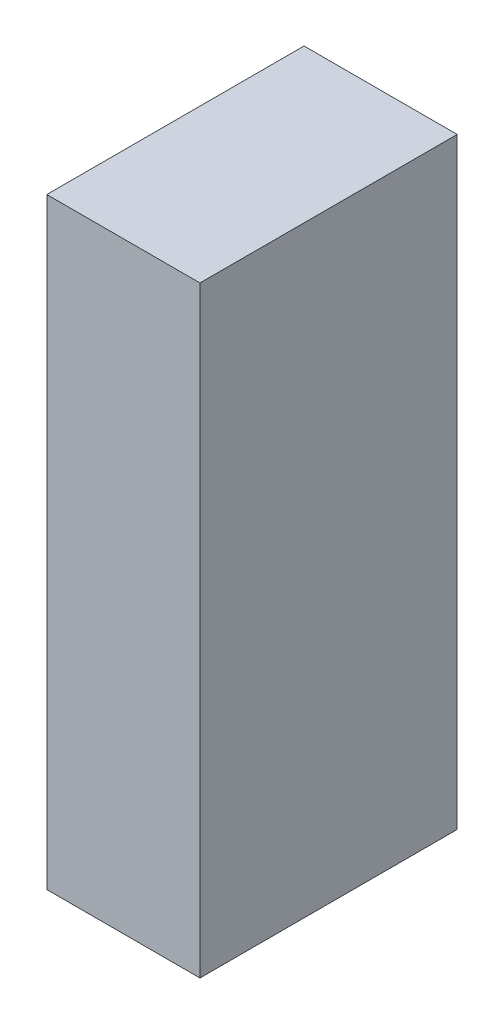
ISO-10303-21;
HEADER;
FILE_DESCRIPTION(('STEP AP214'),'2;1');
FILE_NAME('part.step','',(''),(''),'','','');
FILE_SCHEMA(('AUTOMOTIVE_DESIGN { 1 0 10303 214 1 1 1 1 }'));
ENDSEC;
DATA;
#1=APPLICATION_CONTEXT('core data for automotive mechanical design processes');
#2=APPLICATION_PROTOCOL_DEFINITION('international standard','automotive_design',2000,#1);
#3=PRODUCT_CONTEXT('',#1,'mechanical');
#4=PRODUCT('Part','Part','',(#3));
#5=PRODUCT_RELATED_PRODUCT_CATEGORY('part','',(#4));
#6=PRODUCT_DEFINITION_FORMATION('','',#4);
#7=PRODUCT_DEFINITION_CONTEXT('part definition',#1,'design');
#8=PRODUCT_DEFINITION('design','',#6,#7);
#9=PRODUCT_DEFINITION_SHAPE('','',#8);
#10=(LENGTH_UNIT() NAMED_UNIT(*) SI_UNIT(.MILLI.,.METRE.));
#11=(NAMED_UNIT(*) PLANE_ANGLE_UNIT() SI_UNIT($,.RADIAN.));
#12=(NAMED_UNIT(*) SI_UNIT($,.STERADIAN.) SOLID_ANGLE_UNIT());
#13=UNCERTAINTY_MEASURE_WITH_UNIT(LENGTH_MEASURE(1.E-05),#10,'distance_accuracy_value','');
#14=(GEOMETRIC_REPRESENTATION_CONTEXT(3) GLOBAL_UNCERTAINTY_ASSIGNED_CONTEXT((#13)) GLOBAL_UNIT_ASSIGNED_CONTEXT((#10,
#11,#12)) REPRESENTATION_CONTEXT('',''));
#15=CARTESIAN_POINT('',(0.,0.,0.));
#16=DIRECTION('',(0.,0.,1.));
#17=DIRECTION('',(1.,0.,0.));
#18=AXIS2_PLACEMENT_3D('',#15,#16,#17);
#19=CARTESIAN_POINT('',(-1.714,-1.397,0.));
#20=DIRECTION('',(0.,-1.,0.));
#21=DIRECTION('',(0.,0.,1.));
#22=AXIS2_PLACEMENT_3D('',#19,#20,#21);
#23=PLANE('',#22);
#24=DIRECTION('',(-1.,0.,0.));
#25=VECTOR('',#24,1.);
#26=CARTESIAN_POINT('',(-1.003,-1.397,0.));
#27=LINE('',#26,#25);
#28=CARTESIAN_POINT('',(-1.003,-1.397,0.));
#29=VERTEX_POINT('',#28);
#30=CARTESIAN_POINT('',(-1.714,-1.397,0.));
#31=VERTEX_POINT('',#30);
#32=EDGE_CURVE('E11',#29,#31,#27,.T.);
#33=ORIENTED_EDGE('',*,*,#32,.F.);
#34=DIRECTION('',(0.,0.,-1.));
#35=VECTOR('',#34,1.);
#36=CARTESIAN_POINT('',(-1.003,-1.397,1.194));
#37=LINE('',#36,#35);
#38=CARTESIAN_POINT('',(-1.003,-1.397,1.194));
#39=VERTEX_POINT('',#38);
#40=EDGE_CURVE('E24',#39,#29,#37,.T.);
#41=ORIENTED_EDGE('',*,*,#40,.F.);
#42=DIRECTION('',(1.,0.,0.));
#43=VECTOR('',#42,1.);
#44=CARTESIAN_POINT('',(-1.714,-1.397,1.194));
#45=LINE('',#44,#43);
#46=CARTESIAN_POINT('',(-1.714,-1.397,1.194));
#47=VERTEX_POINT('',#46);
#48=EDGE_CURVE('E88',#47,#39,#45,.T.);
#49=ORIENTED_EDGE('',*,*,#48,.F.);
#50=DIRECTION('',(0.,0.,1.));
#51=VECTOR('',#50,1.);
#52=CARTESIAN_POINT('',(-1.714,-1.397,0.));
#53=LINE('',#52,#51);
#54=EDGE_CURVE('E77',#31,#47,#53,.T.);
#55=ORIENTED_EDGE('',*,*,#54,.F.);
#56=EDGE_LOOP('',(#33,#41,#49,#55));
#57=FACE_BOUND('',#56,.T.);
#58=ADVANCED_FACE('F17',(#57),#23,.T.);
#59=CARTESIAN_POINT('',(-1.003,-1.397,0.));
#60=DIRECTION('',(1.,0.,0.));
#61=DIRECTION('',(0.,0.,1.));
#62=AXIS2_PLACEMENT_3D('',#59,#60,#61);
#63=PLANE('',#62);
#64=DIRECTION('',(0.,-1.,0.));
#65=VECTOR('',#64,1.);
#66=CARTESIAN_POINT('',(-1.003,1.397,0.));
#67=LINE('',#66,#65);
#68=CARTESIAN_POINT('',(-1.003,1.397,0.));
#69=VERTEX_POINT('',#68);
#70=EDGE_CURVE('E85',#69,#29,#67,.T.);
#71=ORIENTED_EDGE('',*,*,#70,.F.);
#72=DIRECTION('',(0.,0.,-1.));
#73=VECTOR('',#72,1.);
#74=CARTESIAN_POINT('',(-1.003,1.397,1.194));
#75=LINE('',#74,#73);
#76=CARTESIAN_POINT('',(-1.003,1.397,1.194));
#77=VERTEX_POINT('',#76);
#78=EDGE_CURVE('E83',#77,#69,#75,.T.);
#79=ORIENTED_EDGE('',*,*,#78,.F.);
#80=DIRECTION('',(0.,1.,0.));
#81=VECTOR('',#80,1.);
#82=CARTESIAN_POINT('',(-1.003,-1.397,1.194));
#83=LINE('',#82,#81);
#84=EDGE_CURVE('E72',#39,#77,#83,.T.);
#85=ORIENTED_EDGE('',*,*,#84,.F.);
#86=ORIENTED_EDGE('',*,*,#40,.T.);
#87=EDGE_LOOP('',(#71,#79,#85,#86));
#88=FACE_BOUND('',#87,.T.);
#89=ADVANCED_FACE('F90',(#88),#63,.T.);
#90=CARTESIAN_POINT('',(-1.003,1.397,0.));
#91=DIRECTION('',(0.,1.,0.));
#92=DIRECTION('',(0.,0.,1.));
#93=AXIS2_PLACEMENT_3D('',#90,#91,#92);
#94=PLANE('',#93);
#95=DIRECTION('',(1.,0.,0.));
#96=VECTOR('',#95,1.);
#97=CARTESIAN_POINT('',(-1.714,1.397,0.));
#98=LINE('',#97,#96);
#99=CARTESIAN_POINT('',(-1.714,1.397,0.));
#100=VERTEX_POINT('',#99);
#101=EDGE_CURVE('E60',#100,#69,#98,.T.);
#102=ORIENTED_EDGE('',*,*,#101,.F.);
#103=DIRECTION('',(0.,0.,-1.));
#104=VECTOR('',#103,1.);
#105=CARTESIAN_POINT('',(-1.714,1.397,1.194));
#106=LINE('',#105,#104);
#107=CARTESIAN_POINT('',(-1.714,1.397,1.194));
#108=VERTEX_POINT('',#107);
#109=EDGE_CURVE('E54',#108,#100,#106,.T.);
#110=ORIENTED_EDGE('',*,*,#109,.F.);
#111=DIRECTION('',(-1.,0.,0.));
#112=VECTOR('',#111,1.);
#113=CARTESIAN_POINT('',(-1.003,1.397,1.194));
#114=LINE('',#113,#112);
#115=EDGE_CURVE('E58',#77,#108,#114,.T.);
#116=ORIENTED_EDGE('',*,*,#115,.F.);
#117=ORIENTED_EDGE('',*,*,#78,.T.);
#118=EDGE_LOOP('',(#102,#110,#116,#117));
#119=FACE_BOUND('',#118,.T.);
#120=ADVANCED_FACE('F56',(#119),#94,.T.);
#121=CARTESIAN_POINT('',(-1.714,1.397,0.));
#122=DIRECTION('',(-1.,0.,0.));
#123=DIRECTION('',(0.,0.,1.));
#124=AXIS2_PLACEMENT_3D('',#121,#122,#123);
#125=PLANE('',#124);
#126=DIRECTION('',(0.,1.,0.));
#127=VECTOR('',#126,1.);
#128=CARTESIAN_POINT('',(-1.714,-1.397,0.));
#129=LINE('',#128,#127);
#130=EDGE_CURVE('E73',#31,#100,#129,.T.);
#131=ORIENTED_EDGE('',*,*,#130,.F.);
#132=ORIENTED_EDGE('',*,*,#54,.T.);
#133=DIRECTION('',(0.,-1.,0.));
#134=VECTOR('',#133,1.);
#135=CARTESIAN_POINT('',(-1.714,1.397,1.194));
#136=LINE('',#135,#134);
#137=EDGE_CURVE('E70',#108,#47,#136,.T.);
#138=ORIENTED_EDGE('',*,*,#137,.F.);
#139=ORIENTED_EDGE('',*,*,#109,.T.);
#140=EDGE_LOOP('',(#131,#132,#138,#139));
#141=FACE_BOUND('',#140,.T.);
#142=ADVANCED_FACE('F76',(#141),#125,.T.);
#143=CARTESIAN_POINT('',(-1.714,1.397,0.));
#144=DIRECTION('',(0.,0.,-1.));
#145=DIRECTION('',(0.,1.,0.));
#146=AXIS2_PLACEMENT_3D('',#143,#144,#145);
#147=PLANE('',#146);
#148=ORIENTED_EDGE('',*,*,#101,.T.);
#149=ORIENTED_EDGE('',*,*,#70,.T.);
#150=ORIENTED_EDGE('',*,*,#32,.T.);
#151=ORIENTED_EDGE('',*,*,#130,.T.);
#152=EDGE_LOOP('',(#148,#149,#150,#151));
#153=FACE_BOUND('',#152,.T.);
#154=ADVANCED_FACE('F91',(#153),#147,.T.);
#155=CARTESIAN_POINT('',(-1.714,-1.397,1.194));
#156=DIRECTION('',(0.,0.,1.));
#157=DIRECTION('',(0.,1.,0.));
#158=AXIS2_PLACEMENT_3D('',#155,#156,#157);
#159=PLANE('',#158);
#160=ORIENTED_EDGE('',*,*,#48,.T.);
#161=ORIENTED_EDGE('',*,*,#84,.T.);
#162=ORIENTED_EDGE('',*,*,#115,.T.);
#163=ORIENTED_EDGE('',*,*,#137,.T.);
#164=EDGE_LOOP('',(#160,#161,#162,#163));
#165=FACE_BOUND('',#164,.T.);
#166=ADVANCED_FACE('F69',(#165),#159,.T.);
#167=CLOSED_SHELL('',(#58,#89,#120,#142,#154,#166));
#168=MANIFOLD_SOLID_BREP('B1',#167);
#169=ADVANCED_BREP_SHAPE_REPRESENTATION('',(#18,#168),#14);
#170=SHAPE_DEFINITION_REPRESENTATION(#9,#169);
ENDSEC;
END-ISO-10303-21;
